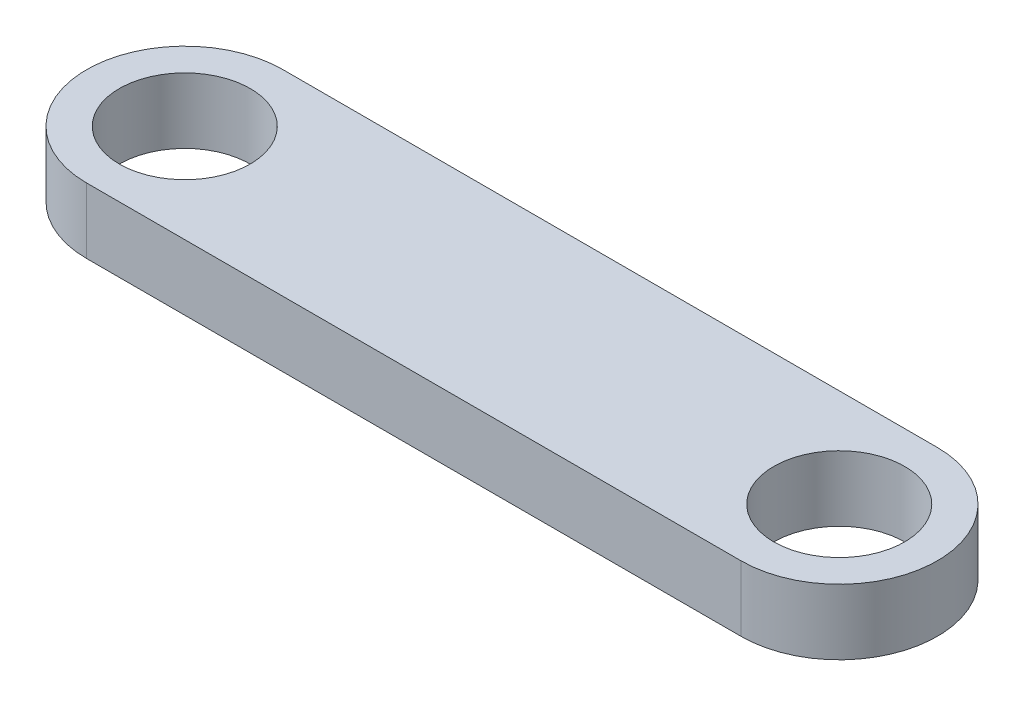
ISO-10303-21;
HEADER;
FILE_DESCRIPTION(('STEP AP214'),'2;1');
FILE_NAME('part.step','',(''),(''),'','','');
FILE_SCHEMA(('AUTOMOTIVE_DESIGN { 1 0 10303 214 1 1 1 1 }'));
ENDSEC;
DATA;
#1=APPLICATION_CONTEXT('core data for automotive mechanical design processes');
#2=APPLICATION_PROTOCOL_DEFINITION('international standard','automotive_design',2000,#1);
#3=PRODUCT_CONTEXT('',#1,'mechanical');
#4=PRODUCT('Part','Part','',(#3));
#5=PRODUCT_RELATED_PRODUCT_CATEGORY('part','',(#4));
#6=PRODUCT_DEFINITION_FORMATION('','',#4);
#7=PRODUCT_DEFINITION_CONTEXT('part definition',#1,'design');
#8=PRODUCT_DEFINITION('design','',#6,#7);
#9=PRODUCT_DEFINITION_SHAPE('','',#8);
#10=(LENGTH_UNIT() NAMED_UNIT(*) SI_UNIT(.MILLI.,.METRE.));
#11=(NAMED_UNIT(*) PLANE_ANGLE_UNIT() SI_UNIT($,.RADIAN.));
#12=(NAMED_UNIT(*) SI_UNIT($,.STERADIAN.) SOLID_ANGLE_UNIT());
#13=UNCERTAINTY_MEASURE_WITH_UNIT(LENGTH_MEASURE(1.E-05),#10,'distance_accuracy_value','');
#14=(GEOMETRIC_REPRESENTATION_CONTEXT(3) GLOBAL_UNCERTAINTY_ASSIGNED_CONTEXT((#13)) GLOBAL_UNIT_ASSIGNED_CONTEXT((#10,
#11,#12)) REPRESENTATION_CONTEXT('',''));
#15=CARTESIAN_POINT('',(0.,0.,0.));
#16=DIRECTION('',(0.,0.,1.));
#17=DIRECTION('',(1.,0.,0.));
#18=AXIS2_PLACEMENT_3D('',#15,#16,#17);
#19=CARTESIAN_POINT('',(0.,6.35,0.));
#20=DIRECTION('',(0.,1.,0.));
#21=DIRECTION('',(0.,0.,1.));
#22=AXIS2_PLACEMENT_3D('',#19,#20,#21);
#23=PLANE('',#22);
#24=CARTESIAN_POINT('',(-63.5,6.35,0.));
#25=DIRECTION('',(0.,1.,0.));
#26=DIRECTION('',(0.,0.,1.));
#27=AXIS2_PLACEMENT_3D('',#24,#25,#26);
#28=CIRCLE('',#27,6.35);
#29=CARTESIAN_POINT('',(-63.5,6.35,6.35000000000001));
#30=VERTEX_POINT('',#29);
#31=EDGE_CURVE('E116',#30,#30,#28,.T.);
#32=ORIENTED_EDGE('',*,*,#31,.F.);
#33=EDGE_LOOP('',(#32));
#34=FACE_BOUND('',#33,.T.);
#35=CARTESIAN_POINT('',(0.,6.35,0.));
#36=DIRECTION('',(0.,1.,0.));
#37=DIRECTION('',(0.,0.,1.));
#38=AXIS2_PLACEMENT_3D('',#35,#36,#37);
#39=CIRCLE('',#38,9.525);
#40=CARTESIAN_POINT('',(0.,6.35,9.525));
#41=VERTEX_POINT('',#40);
#42=CARTESIAN_POINT('',(0.,6.35,-9.525));
#43=VERTEX_POINT('',#42);
#44=EDGE_CURVE('E96',#41,#43,#39,.T.);
#45=ORIENTED_EDGE('',*,*,#44,.T.);
#46=DIRECTION('',(-1.,0.,0.));
#47=VECTOR('',#46,1.);
#48=CARTESIAN_POINT('',(0.,6.35,-9.525));
#49=LINE('',#48,#47);
#50=CARTESIAN_POINT('',(-63.5,6.35,-9.52499999999999));
#51=VERTEX_POINT('',#50);
#52=EDGE_CURVE('E91',#43,#51,#49,.T.);
#53=ORIENTED_EDGE('',*,*,#52,.T.);
#54=CARTESIAN_POINT('',(-63.5,6.35,0.));
#55=DIRECTION('',(0.,1.,0.));
#56=DIRECTION('',(0.,0.,1.));
#57=AXIS2_PLACEMENT_3D('',#54,#55,#56);
#58=CIRCLE('',#57,9.525);
#59=CARTESIAN_POINT('',(-63.5,6.35,9.525));
#60=VERTEX_POINT('',#59);
#61=EDGE_CURVE('E94',#51,#60,#58,.T.);
#62=ORIENTED_EDGE('',*,*,#61,.T.);
#63=DIRECTION('',(1.,0.,0.));
#64=VECTOR('',#63,1.);
#65=CARTESIAN_POINT('',(0.,6.35,9.525));
#66=LINE('',#65,#64);
#67=EDGE_CURVE('E61',#60,#41,#66,.T.);
#68=ORIENTED_EDGE('',*,*,#67,.T.);
#69=EDGE_LOOP('',(#45,#53,#62,#68));
#70=FACE_BOUND('',#69,.T.);
#71=CARTESIAN_POINT('',(0.,6.35,0.));
#72=DIRECTION('',(0.,1.,0.));
#73=DIRECTION('',(0.,0.,1.));
#74=AXIS2_PLACEMENT_3D('',#71,#72,#73);
#75=CIRCLE('',#74,6.35);
#76=CARTESIAN_POINT('',(0.,6.35,6.35));
#77=VERTEX_POINT('',#76);
#78=EDGE_CURVE('E138',#77,#77,#75,.T.);
#79=ORIENTED_EDGE('',*,*,#78,.F.);
#80=EDGE_LOOP('',(#79));
#81=FACE_BOUND('',#80,.T.);
#82=ADVANCED_FACE('F43',(#34,#70,#81),#23,.T.);
#83=CARTESIAN_POINT('',(0.,0.,0.));
#84=DIRECTION('',(0.,1.,0.));
#85=DIRECTION('',(0.,0.,1.));
#86=AXIS2_PLACEMENT_3D('',#83,#84,#85);
#87=PLANE('',#86);
#88=CARTESIAN_POINT('',(0.,0.,0.));
#89=DIRECTION('',(0.,1.,0.));
#90=DIRECTION('',(0.,0.,1.));
#91=AXIS2_PLACEMENT_3D('',#88,#89,#90);
#92=CIRCLE('',#91,9.525);
#93=CARTESIAN_POINT('',(0.,0.,9.525));
#94=VERTEX_POINT('',#93);
#95=CARTESIAN_POINT('',(0.,0.,-9.525));
#96=VERTEX_POINT('',#95);
#97=EDGE_CURVE('E112',#94,#96,#92,.T.);
#98=ORIENTED_EDGE('',*,*,#97,.F.);
#99=DIRECTION('',(1.,0.,0.));
#100=VECTOR('',#99,1.);
#101=CARTESIAN_POINT('',(0.,0.,9.525));
#102=LINE('',#101,#100);
#103=CARTESIAN_POINT('',(-63.5,0.,9.525));
#104=VERTEX_POINT('',#103);
#105=EDGE_CURVE('E84',#104,#94,#102,.T.);
#106=ORIENTED_EDGE('',*,*,#105,.F.);
#107=CARTESIAN_POINT('',(-63.5,0.,0.));
#108=DIRECTION('',(0.,1.,0.));
#109=DIRECTION('',(0.,0.,1.));
#110=AXIS2_PLACEMENT_3D('',#107,#108,#109);
#111=CIRCLE('',#110,9.525);
#112=CARTESIAN_POINT('',(-63.5,0.,-9.52499999999999));
#113=VERTEX_POINT('',#112);
#114=EDGE_CURVE('E78',#113,#104,#111,.T.);
#115=ORIENTED_EDGE('',*,*,#114,.F.);
#116=DIRECTION('',(-1.,0.,0.));
#117=VECTOR('',#116,1.);
#118=CARTESIAN_POINT('',(0.,0.,-9.525));
#119=LINE('',#118,#117);
#120=EDGE_CURVE('E101',#96,#113,#119,.T.);
#121=ORIENTED_EDGE('',*,*,#120,.F.);
#122=EDGE_LOOP('',(#98,#106,#115,#121));
#123=FACE_BOUND('',#122,.T.);
#124=CARTESIAN_POINT('',(-63.5,0.,0.));
#125=DIRECTION('',(0.,1.,0.));
#126=DIRECTION('',(0.,0.,1.));
#127=AXIS2_PLACEMENT_3D('',#124,#125,#126);
#128=CIRCLE('',#127,6.35);
#129=CARTESIAN_POINT('',(-63.5,0.,6.35000000000001));
#130=VERTEX_POINT('',#129);
#131=EDGE_CURVE('E134',#130,#130,#128,.T.);
#132=ORIENTED_EDGE('',*,*,#131,.T.);
#133=EDGE_LOOP('',(#132));
#134=FACE_BOUND('',#133,.T.);
#135=CARTESIAN_POINT('',(0.,0.,0.));
#136=DIRECTION('',(0.,1.,0.));
#137=DIRECTION('',(0.,0.,1.));
#138=AXIS2_PLACEMENT_3D('',#135,#136,#137);
#139=CIRCLE('',#138,6.35);
#140=CARTESIAN_POINT('',(0.,0.,6.35));
#141=VERTEX_POINT('',#140);
#142=EDGE_CURVE('E142',#141,#141,#139,.T.);
#143=ORIENTED_EDGE('',*,*,#142,.T.);
#144=EDGE_LOOP('',(#143));
#145=FACE_BOUND('',#144,.T.);
#146=ADVANCED_FACE('F129',(#123,#134,#145),#87,.F.);
#147=CARTESIAN_POINT('',(0.,6.35,0.));
#148=DIRECTION('',(0.,-1.,0.));
#149=DIRECTION('',(0.,0.,-1.));
#150=AXIS2_PLACEMENT_3D('',#147,#148,#149);
#151=CYLINDRICAL_SURFACE('',#150,9.525);
#152=ORIENTED_EDGE('',*,*,#97,.T.);
#153=DIRECTION('',(0.,-1.,0.));
#154=VECTOR('',#153,1.);
#155=CARTESIAN_POINT('',(0.,6.35,-9.525));
#156=LINE('',#155,#154);
#157=EDGE_CURVE('E11',#43,#96,#156,.T.);
#158=ORIENTED_EDGE('',*,*,#157,.F.);
#159=ORIENTED_EDGE('',*,*,#44,.F.);
#160=DIRECTION('',(0.,-1.,0.));
#161=VECTOR('',#160,1.);
#162=CARTESIAN_POINT('',(0.,6.35,9.525));
#163=LINE('',#162,#161);
#164=EDGE_CURVE('E108',#41,#94,#163,.T.);
#165=ORIENTED_EDGE('',*,*,#164,.T.);
#166=EDGE_LOOP('',(#152,#158,#159,#165));
#167=FACE_BOUND('',#166,.T.);
#168=ADVANCED_FACE('F45',(#167),#151,.T.);
#169=CARTESIAN_POINT('',(0.,6.35,-9.525));
#170=DIRECTION('',(0.,0.,1.));
#171=DIRECTION('',(1.,0.,0.));
#172=AXIS2_PLACEMENT_3D('',#169,#170,#171);
#173=PLANE('',#172);
#174=ORIENTED_EDGE('',*,*,#120,.T.);
#175=DIRECTION('',(0.,-1.,0.));
#176=VECTOR('',#175,1.);
#177=CARTESIAN_POINT('',(-63.5,6.35,-9.52499999999999));
#178=LINE('',#177,#176);
#179=EDGE_CURVE('E53',#51,#113,#178,.T.);
#180=ORIENTED_EDGE('',*,*,#179,.F.);
#181=ORIENTED_EDGE('',*,*,#52,.F.);
#182=ORIENTED_EDGE('',*,*,#157,.T.);
#183=EDGE_LOOP('',(#174,#180,#181,#182));
#184=FACE_BOUND('',#183,.T.);
#185=ADVANCED_FACE('F100',(#184),#173,.F.);
#186=CARTESIAN_POINT('',(-63.5,6.35,0.));
#187=DIRECTION('',(0.,-1.,0.));
#188=DIRECTION('',(0.,0.,-1.));
#189=AXIS2_PLACEMENT_3D('',#186,#187,#188);
#190=CYLINDRICAL_SURFACE('',#189,9.525);
#191=ORIENTED_EDGE('',*,*,#114,.T.);
#192=DIRECTION('',(0.,-1.,0.));
#193=VECTOR('',#192,1.);
#194=CARTESIAN_POINT('',(-63.5,6.35,9.525));
#195=LINE('',#194,#193);
#196=EDGE_CURVE('E103',#60,#104,#195,.T.);
#197=ORIENTED_EDGE('',*,*,#196,.F.);
#198=ORIENTED_EDGE('',*,*,#61,.F.);
#199=ORIENTED_EDGE('',*,*,#179,.T.);
#200=EDGE_LOOP('',(#191,#197,#198,#199));
#201=FACE_BOUND('',#200,.T.);
#202=ADVANCED_FACE('F104',(#201),#190,.T.);
#203=CARTESIAN_POINT('',(0.,6.35,9.525));
#204=DIRECTION('',(0.,0.,-1.));
#205=DIRECTION('',(-1.,0.,0.));
#206=AXIS2_PLACEMENT_3D('',#203,#204,#205);
#207=PLANE('',#206);
#208=ORIENTED_EDGE('',*,*,#105,.T.);
#209=ORIENTED_EDGE('',*,*,#164,.F.);
#210=ORIENTED_EDGE('',*,*,#67,.F.);
#211=ORIENTED_EDGE('',*,*,#196,.T.);
#212=EDGE_LOOP('',(#208,#209,#210,#211));
#213=FACE_BOUND('',#212,.T.);
#214=ADVANCED_FACE('F126',(#213),#207,.F.);
#215=CARTESIAN_POINT('',(-63.5,6.35,0.));
#216=DIRECTION('',(0.,-1.,0.));
#217=DIRECTION('',(0.,0.,-1.));
#218=AXIS2_PLACEMENT_3D('',#215,#216,#217);
#219=CYLINDRICAL_SURFACE('',#218,6.35);
#220=ORIENTED_EDGE('',*,*,#31,.T.);
#221=EDGE_LOOP('',(#220));
#222=FACE_BOUND('',#221,.T.);
#223=ORIENTED_EDGE('',*,*,#131,.F.);
#224=EDGE_LOOP('',(#223));
#225=FACE_BOUND('',#224,.T.);
#226=ADVANCED_FACE('F161',(#222,#225),#219,.F.);
#227=CARTESIAN_POINT('',(0.,6.35,0.));
#228=DIRECTION('',(0.,-1.,0.));
#229=DIRECTION('',(0.,0.,-1.));
#230=AXIS2_PLACEMENT_3D('',#227,#228,#229);
#231=CYLINDRICAL_SURFACE('',#230,6.35);
#232=ORIENTED_EDGE('',*,*,#78,.T.);
#233=EDGE_LOOP('',(#232));
#234=FACE_BOUND('',#233,.T.);
#235=ORIENTED_EDGE('',*,*,#142,.F.);
#236=EDGE_LOOP('',(#235));
#237=FACE_BOUND('',#236,.T.);
#238=ADVANCED_FACE('F150',(#234,#237),#231,.F.);
#239=CLOSED_SHELL('',(#82,#146,#168,#185,#202,#214,#226,#238));
#240=MANIFOLD_SOLID_BREP('B2',#239);
#241=ADVANCED_BREP_SHAPE_REPRESENTATION('',(#18,#240),#14);
#242=SHAPE_DEFINITION_REPRESENTATION(#9,#241);
ENDSEC;
END-ISO-10303-21;
